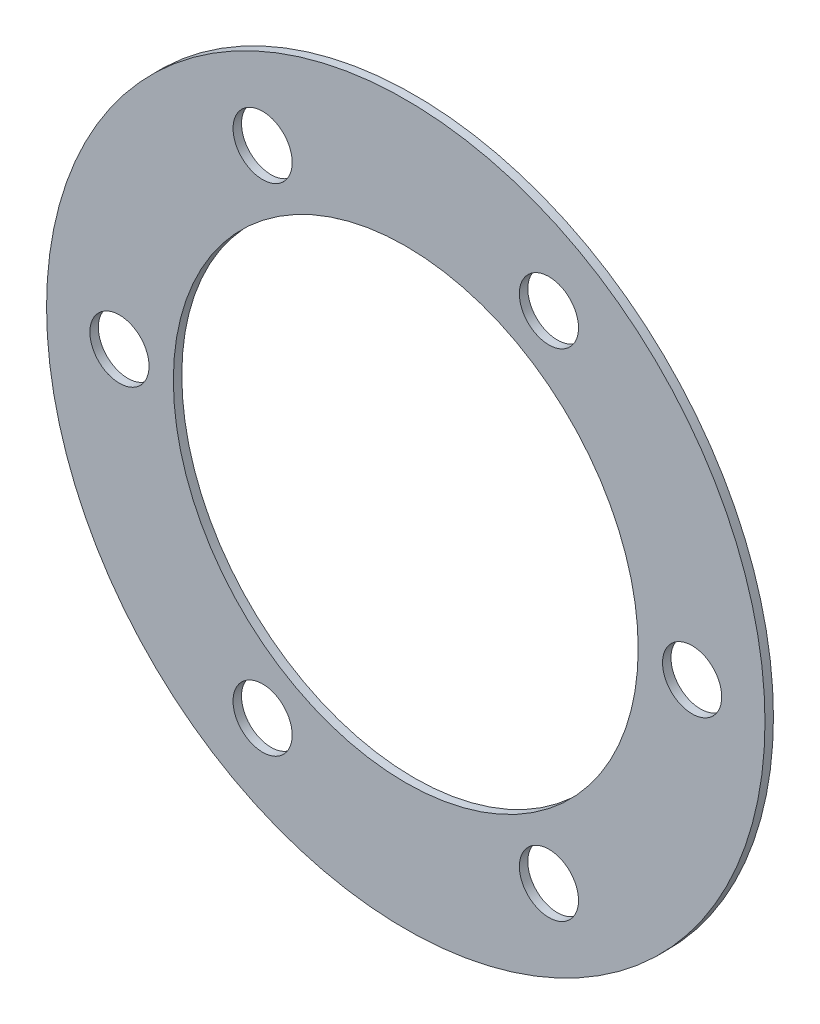
ISO-10303-21;
HEADER;
FILE_DESCRIPTION(('STEP AP214'),'2;1');
FILE_NAME('part.step','',(''),(''),'','','');
FILE_SCHEMA(('AUTOMOTIVE_DESIGN { 1 0 10303 214 1 1 1 1 }'));
ENDSEC;
DATA;
#1=APPLICATION_CONTEXT('core data for automotive mechanical design processes');
#2=APPLICATION_PROTOCOL_DEFINITION('international standard','automotive_design',2000,#1);
#3=PRODUCT_CONTEXT('',#1,'mechanical');
#4=PRODUCT('Part','Part','',(#3));
#5=PRODUCT_RELATED_PRODUCT_CATEGORY('part','',(#4));
#6=PRODUCT_DEFINITION_FORMATION('','',#4);
#7=PRODUCT_DEFINITION_CONTEXT('part definition',#1,'design');
#8=PRODUCT_DEFINITION('design','',#6,#7);
#9=PRODUCT_DEFINITION_SHAPE('','',#8);
#10=(LENGTH_UNIT() NAMED_UNIT(*) SI_UNIT(.MILLI.,.METRE.));
#11=(NAMED_UNIT(*) PLANE_ANGLE_UNIT() SI_UNIT($,.RADIAN.));
#12=(NAMED_UNIT(*) SI_UNIT($,.STERADIAN.) SOLID_ANGLE_UNIT());
#13=UNCERTAINTY_MEASURE_WITH_UNIT(LENGTH_MEASURE(1.E-05),#10,'distance_accuracy_value','');
#14=(GEOMETRIC_REPRESENTATION_CONTEXT(3) GLOBAL_UNCERTAINTY_ASSIGNED_CONTEXT((#13)) GLOBAL_UNIT_ASSIGNED_CONTEXT((#10,
#11,#12)) REPRESENTATION_CONTEXT('',''));
#15=CARTESIAN_POINT('',(0.,0.,0.));
#16=DIRECTION('',(0.,0.,1.));
#17=DIRECTION('',(1.,0.,0.));
#18=AXIS2_PLACEMENT_3D('',#15,#16,#17);
#19=CARTESIAN_POINT('',(0.,0.,1.));
#20=DIRECTION('',(0.,0.,1.));
#21=DIRECTION('',(1.,0.,0.));
#22=AXIS2_PLACEMENT_3D('',#19,#20,#21);
#23=PLANE('',#22);
#24=CARTESIAN_POINT('',(-33.875,0.,1.));
#25=DIRECTION('',(0.,0.,1.));
#26=DIRECTION('',(1.,0.,0.));
#27=AXIS2_PLACEMENT_3D('',#24,#25,#26);
#28=CIRCLE('',#27,3.49999999999999);
#29=CARTESIAN_POINT('',(-30.375,0.,1.));
#30=VERTEX_POINT('',#29);
#31=EDGE_CURVE('E85',#30,#30,#28,.T.);
#32=ORIENTED_EDGE('',*,*,#31,.F.);
#33=EDGE_LOOP('',(#32));
#34=FACE_BOUND('',#33,.T.);
#35=CARTESIAN_POINT('',(-16.9374999999999,-29.3366105531979,1.));
#36=DIRECTION('',(0.,0.,1.));
#37=DIRECTION('',(1.,0.,0.));
#38=AXIS2_PLACEMENT_3D('',#35,#36,#37);
#39=CIRCLE('',#38,3.49999999999999);
#40=CARTESIAN_POINT('',(-13.4375,-29.3366105531979,1.));
#41=VERTEX_POINT('',#40);
#42=EDGE_CURVE('E79',#41,#41,#39,.T.);
#43=ORIENTED_EDGE('',*,*,#42,.F.);
#44=EDGE_LOOP('',(#43));
#45=FACE_BOUND('',#44,.T.);
#46=CARTESIAN_POINT('',(16.9375000000001,-29.3366105531978,1.));
#47=DIRECTION('',(0.,0.,1.));
#48=DIRECTION('',(1.,0.,0.));
#49=AXIS2_PLACEMENT_3D('',#46,#47,#48);
#50=CIRCLE('',#49,3.49999999999999);
#51=CARTESIAN_POINT('',(20.4375000000001,-29.3366105531978,1.));
#52=VERTEX_POINT('',#51);
#53=EDGE_CURVE('E73',#52,#52,#50,.T.);
#54=ORIENTED_EDGE('',*,*,#53,.F.);
#55=EDGE_LOOP('',(#54));
#56=FACE_BOUND('',#55,.T.);
#57=CARTESIAN_POINT('',(33.875,0.,1.));
#58=DIRECTION('',(0.,0.,1.));
#59=DIRECTION('',(1.,0.,0.));
#60=AXIS2_PLACEMENT_3D('',#57,#58,#59);
#61=CIRCLE('',#60,3.49999999999999);
#62=CARTESIAN_POINT('',(37.375,0.,1.));
#63=VERTEX_POINT('',#62);
#64=EDGE_CURVE('E67',#63,#63,#61,.T.);
#65=ORIENTED_EDGE('',*,*,#64,.F.);
#66=EDGE_LOOP('',(#65));
#67=FACE_BOUND('',#66,.T.);
#68=CARTESIAN_POINT('',(16.9374999999997,29.336610553198,1.));
#69=DIRECTION('',(0.,0.,1.));
#70=DIRECTION('',(1.,0.,0.));
#71=AXIS2_PLACEMENT_3D('',#68,#69,#70);
#72=CIRCLE('',#71,3.49999999999999);
#73=CARTESIAN_POINT('',(20.4374999999997,29.336610553198,1.));
#74=VERTEX_POINT('',#73);
#75=EDGE_CURVE('E61',#74,#74,#72,.T.);
#76=ORIENTED_EDGE('',*,*,#75,.F.);
#77=EDGE_LOOP('',(#76));
#78=FACE_BOUND('',#77,.T.);
#79=CARTESIAN_POINT('',(-16.9375000000003,29.3366105531977,1.));
#80=DIRECTION('',(0.,0.,1.));
#81=DIRECTION('',(1.,0.,0.));
#82=AXIS2_PLACEMENT_3D('',#79,#80,#81);
#83=CIRCLE('',#82,3.49999999999999);
#84=CARTESIAN_POINT('',(-13.4375000000003,29.3366105531977,1.));
#85=VERTEX_POINT('',#84);
#86=EDGE_CURVE('E55',#85,#85,#83,.T.);
#87=ORIENTED_EDGE('',*,*,#86,.F.);
#88=EDGE_LOOP('',(#87));
#89=FACE_BOUND('',#88,.T.);
#90=CARTESIAN_POINT('',(0.,0.,1.));
#91=DIRECTION('',(0.,0.,1.));
#92=DIRECTION('',(1.,0.,0.));
#93=AXIS2_PLACEMENT_3D('',#90,#91,#92);
#94=CIRCLE('',#93,42.5);
#95=CARTESIAN_POINT('',(42.5,0.,1.));
#96=VERTEX_POINT('',#95);
#97=EDGE_CURVE('E10',#96,#96,#94,.T.);
#98=ORIENTED_EDGE('',*,*,#97,.T.);
#99=EDGE_LOOP('',(#98));
#100=FACE_BOUND('',#99,.T.);
#101=CARTESIAN_POINT('',(0.,0.,1.));
#102=DIRECTION('',(0.,0.,1.));
#103=DIRECTION('',(1.,0.,0.));
#104=AXIS2_PLACEMENT_3D('',#101,#102,#103);
#105=CIRCLE('',#104,27.5);
#106=CARTESIAN_POINT('',(27.5,0.,1.));
#107=VERTEX_POINT('',#106);
#108=EDGE_CURVE('E45',#107,#107,#105,.T.);
#109=ORIENTED_EDGE('',*,*,#108,.F.);
#110=EDGE_LOOP('',(#109));
#111=FACE_BOUND('',#110,.T.);
#112=ADVANCED_FACE('F34',(#34,#45,#56,#67,#78,#89,#100,#111),#23,.T.);
#113=CARTESIAN_POINT('',(0.,0.,0.));
#114=DIRECTION('',(0.,0.,1.));
#115=DIRECTION('',(1.,0.,0.));
#116=AXIS2_PLACEMENT_3D('',#113,#114,#115);
#117=PLANE('',#116);
#118=CARTESIAN_POINT('',(-33.875,0.,0.));
#119=DIRECTION('',(0.,0.,1.));
#120=DIRECTION('',(1.,0.,0.));
#121=AXIS2_PLACEMENT_3D('',#118,#119,#120);
#122=CIRCLE('',#121,3.5);
#123=CARTESIAN_POINT('',(-30.375,0.,0.));
#124=VERTEX_POINT('',#123);
#125=EDGE_CURVE('E82',#124,#124,#122,.T.);
#126=ORIENTED_EDGE('',*,*,#125,.T.);
#127=EDGE_LOOP('',(#126));
#128=FACE_BOUND('',#127,.T.);
#129=CARTESIAN_POINT('',(-16.9374999999999,-29.3366105531979,0.));
#130=DIRECTION('',(0.,0.,1.));
#131=DIRECTION('',(1.,0.,0.));
#132=AXIS2_PLACEMENT_3D('',#129,#130,#131);
#133=CIRCLE('',#132,3.5);
#134=CARTESIAN_POINT('',(-13.4374999999999,-29.3366105531979,0.));
#135=VERTEX_POINT('',#134);
#136=EDGE_CURVE('E76',#135,#135,#133,.T.);
#137=ORIENTED_EDGE('',*,*,#136,.T.);
#138=EDGE_LOOP('',(#137));
#139=FACE_BOUND('',#138,.T.);
#140=CARTESIAN_POINT('',(16.9375000000001,-29.3366105531978,0.));
#141=DIRECTION('',(0.,0.,1.));
#142=DIRECTION('',(1.,0.,0.));
#143=AXIS2_PLACEMENT_3D('',#140,#141,#142);
#144=CIRCLE('',#143,3.5);
#145=CARTESIAN_POINT('',(20.4375000000001,-29.3366105531978,0.));
#146=VERTEX_POINT('',#145);
#147=EDGE_CURVE('E70',#146,#146,#144,.T.);
#148=ORIENTED_EDGE('',*,*,#147,.T.);
#149=EDGE_LOOP('',(#148));
#150=FACE_BOUND('',#149,.T.);
#151=CARTESIAN_POINT('',(33.875,0.,0.));
#152=DIRECTION('',(0.,0.,1.));
#153=DIRECTION('',(1.,0.,0.));
#154=AXIS2_PLACEMENT_3D('',#151,#152,#153);
#155=CIRCLE('',#154,3.5);
#156=CARTESIAN_POINT('',(37.375,0.,0.));
#157=VERTEX_POINT('',#156);
#158=EDGE_CURVE('E64',#157,#157,#155,.T.);
#159=ORIENTED_EDGE('',*,*,#158,.T.);
#160=EDGE_LOOP('',(#159));
#161=FACE_BOUND('',#160,.T.);
#162=CARTESIAN_POINT('',(16.9374999999997,29.336610553198,0.));
#163=DIRECTION('',(0.,0.,1.));
#164=DIRECTION('',(1.,0.,0.));
#165=AXIS2_PLACEMENT_3D('',#162,#163,#164);
#166=CIRCLE('',#165,3.5);
#167=CARTESIAN_POINT('',(20.4374999999997,29.336610553198,0.));
#168=VERTEX_POINT('',#167);
#169=EDGE_CURVE('E58',#168,#168,#166,.T.);
#170=ORIENTED_EDGE('',*,*,#169,.T.);
#171=EDGE_LOOP('',(#170));
#172=FACE_BOUND('',#171,.T.);
#173=CARTESIAN_POINT('',(-16.9375000000003,29.3366105531977,0.));
#174=DIRECTION('',(0.,0.,1.));
#175=DIRECTION('',(1.,0.,0.));
#176=AXIS2_PLACEMENT_3D('',#173,#174,#175);
#177=CIRCLE('',#176,3.5);
#178=CARTESIAN_POINT('',(-13.4375000000003,29.3366105531977,0.));
#179=VERTEX_POINT('',#178);
#180=EDGE_CURVE('E50',#179,#179,#177,.T.);
#181=ORIENTED_EDGE('',*,*,#180,.T.);
#182=EDGE_LOOP('',(#181));
#183=FACE_BOUND('',#182,.T.);
#184=CARTESIAN_POINT('',(0.,0.,0.));
#185=DIRECTION('',(0.,0.,1.));
#186=DIRECTION('',(1.,0.,0.));
#187=AXIS2_PLACEMENT_3D('',#184,#185,#186);
#188=CIRCLE('',#187,42.5);
#189=CARTESIAN_POINT('',(42.5,0.,0.));
#190=VERTEX_POINT('',#189);
#191=EDGE_CURVE('E38',#190,#190,#188,.T.);
#192=ORIENTED_EDGE('',*,*,#191,.F.);
#193=EDGE_LOOP('',(#192));
#194=FACE_BOUND('',#193,.T.);
#195=CARTESIAN_POINT('',(0.,0.,0.));
#196=DIRECTION('',(0.,0.,1.));
#197=DIRECTION('',(1.,0.,0.));
#198=AXIS2_PLACEMENT_3D('',#195,#196,#197);
#199=CIRCLE('',#198,27.5);
#200=CARTESIAN_POINT('',(27.5,0.,0.));
#201=VERTEX_POINT('',#200);
#202=EDGE_CURVE('E47',#201,#201,#199,.T.);
#203=ORIENTED_EDGE('',*,*,#202,.T.);
#204=EDGE_LOOP('',(#203));
#205=FACE_BOUND('',#204,.T.);
#206=ADVANCED_FACE('F93',(#128,#139,#150,#161,#172,#183,#194,#205),#117,.F.);
#207=CARTESIAN_POINT('',(0.,0.,1.));
#208=DIRECTION('',(0.,0.,-1.));
#209=DIRECTION('',(-1.,0.,0.));
#210=AXIS2_PLACEMENT_3D('',#207,#208,#209);
#211=CYLINDRICAL_SURFACE('',#210,42.5);
#212=ORIENTED_EDGE('',*,*,#97,.F.);
#213=EDGE_LOOP('',(#212));
#214=FACE_BOUND('',#213,.T.);
#215=ORIENTED_EDGE('',*,*,#191,.T.);
#216=EDGE_LOOP('',(#215));
#217=FACE_BOUND('',#216,.T.);
#218=ADVANCED_FACE('F36',(#214,#217),#211,.T.);
#219=CARTESIAN_POINT('',(0.,0.,1.));
#220=DIRECTION('',(0.,0.,-1.));
#221=DIRECTION('',(-1.,0.,0.));
#222=AXIS2_PLACEMENT_3D('',#219,#220,#221);
#223=CYLINDRICAL_SURFACE('',#222,27.5);
#224=ORIENTED_EDGE('',*,*,#108,.T.);
#225=EDGE_LOOP('',(#224));
#226=FACE_BOUND('',#225,.T.);
#227=ORIENTED_EDGE('',*,*,#202,.F.);
#228=EDGE_LOOP('',(#227));
#229=FACE_BOUND('',#228,.T.);
#230=ADVANCED_FACE('F107',(#226,#229),#223,.F.);
#231=CARTESIAN_POINT('',(-16.9375000000003,29.3366105531977,1.));
#232=DIRECTION('',(0.,0.,1.));
#233=DIRECTION('',(1.,0.,0.));
#234=AXIS2_PLACEMENT_3D('',#231,#232,#233);
#235=CYLINDRICAL_SURFACE('',#234,3.49999999999999);
#236=ORIENTED_EDGE('',*,*,#180,.F.);
#237=EDGE_LOOP('',(#236));
#238=FACE_BOUND('',#237,.T.);
#239=ORIENTED_EDGE('',*,*,#86,.T.);
#240=EDGE_LOOP('',(#239));
#241=FACE_BOUND('',#240,.T.);
#242=ADVANCED_FACE('F110',(#238,#241),#235,.F.);
#243=CARTESIAN_POINT('',(16.9374999999997,29.336610553198,1.));
#244=DIRECTION('',(0.,0.,1.));
#245=DIRECTION('',(1.,0.,0.));
#246=AXIS2_PLACEMENT_3D('',#243,#244,#245);
#247=CYLINDRICAL_SURFACE('',#246,3.49999999999999);
#248=ORIENTED_EDGE('',*,*,#169,.F.);
#249=EDGE_LOOP('',(#248));
#250=FACE_BOUND('',#249,.T.);
#251=ORIENTED_EDGE('',*,*,#75,.T.);
#252=EDGE_LOOP('',(#251));
#253=FACE_BOUND('',#252,.T.);
#254=ADVANCED_FACE('F124',(#250,#253),#247,.F.);
#255=CARTESIAN_POINT('',(33.875,0.,1.));
#256=DIRECTION('',(0.,0.,1.));
#257=DIRECTION('',(1.,0.,0.));
#258=AXIS2_PLACEMENT_3D('',#255,#256,#257);
#259=CYLINDRICAL_SURFACE('',#258,3.49999999999999);
#260=ORIENTED_EDGE('',*,*,#158,.F.);
#261=EDGE_LOOP('',(#260));
#262=FACE_BOUND('',#261,.T.);
#263=ORIENTED_EDGE('',*,*,#64,.T.);
#264=EDGE_LOOP('',(#263));
#265=FACE_BOUND('',#264,.T.);
#266=ADVANCED_FACE('F128',(#262,#265),#259,.F.);
#267=CARTESIAN_POINT('',(16.9375000000001,-29.3366105531978,1.));
#268=DIRECTION('',(0.,0.,1.));
#269=DIRECTION('',(1.,0.,0.));
#270=AXIS2_PLACEMENT_3D('',#267,#268,#269);
#271=CYLINDRICAL_SURFACE('',#270,3.49999999999999);
#272=ORIENTED_EDGE('',*,*,#147,.F.);
#273=EDGE_LOOP('',(#272));
#274=FACE_BOUND('',#273,.T.);
#275=ORIENTED_EDGE('',*,*,#53,.T.);
#276=EDGE_LOOP('',(#275));
#277=FACE_BOUND('',#276,.T.);
#278=ADVANCED_FACE('F132',(#274,#277),#271,.F.);
#279=CARTESIAN_POINT('',(-16.9374999999999,-29.3366105531979,1.));
#280=DIRECTION('',(0.,0.,1.));
#281=DIRECTION('',(1.,0.,0.));
#282=AXIS2_PLACEMENT_3D('',#279,#280,#281);
#283=CYLINDRICAL_SURFACE('',#282,3.49999999999999);
#284=ORIENTED_EDGE('',*,*,#136,.F.);
#285=EDGE_LOOP('',(#284));
#286=FACE_BOUND('',#285,.T.);
#287=ORIENTED_EDGE('',*,*,#42,.T.);
#288=EDGE_LOOP('',(#287));
#289=FACE_BOUND('',#288,.T.);
#290=ADVANCED_FACE('F136',(#286,#289),#283,.F.);
#291=CARTESIAN_POINT('',(-33.875,0.,1.));
#292=DIRECTION('',(0.,0.,1.));
#293=DIRECTION('',(1.,0.,0.));
#294=AXIS2_PLACEMENT_3D('',#291,#292,#293);
#295=CYLINDRICAL_SURFACE('',#294,3.49999999999999);
#296=ORIENTED_EDGE('',*,*,#125,.F.);
#297=EDGE_LOOP('',(#296));
#298=FACE_BOUND('',#297,.T.);
#299=ORIENTED_EDGE('',*,*,#31,.T.);
#300=EDGE_LOOP('',(#299));
#301=FACE_BOUND('',#300,.T.);
#302=ADVANCED_FACE('F89',(#298,#301),#295,.F.);
#303=CLOSED_SHELL('',(#112,#206,#218,#230,#242,#254,#266,#278,#290,#302));
#304=MANIFOLD_SOLID_BREP('B2',#303);
#305=ADVANCED_BREP_SHAPE_REPRESENTATION('',(#18,#304),#14);
#306=SHAPE_DEFINITION_REPRESENTATION(#9,#305);
ENDSEC;
END-ISO-10303-21;
